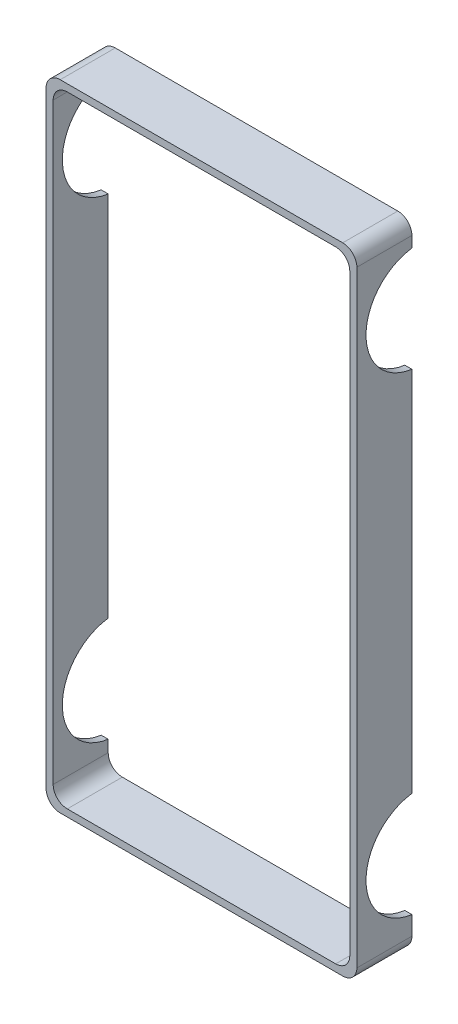
ISO-10303-21;
HEADER;
FILE_DESCRIPTION(('STEP AP214'),'2;1');
FILE_NAME('part.step','',(''),(''),'','','');
FILE_SCHEMA(('AUTOMOTIVE_DESIGN { 1 0 10303 214 1 1 1 1 }'));
ENDSEC;
DATA;
#1=APPLICATION_CONTEXT('core data for automotive mechanical design processes');
#2=APPLICATION_PROTOCOL_DEFINITION('international standard','automotive_design',2000,#1);
#3=PRODUCT_CONTEXT('',#1,'mechanical');
#4=PRODUCT('Part','Part','',(#3));
#5=PRODUCT_RELATED_PRODUCT_CATEGORY('part','',(#4));
#6=PRODUCT_DEFINITION_FORMATION('','',#4);
#7=PRODUCT_DEFINITION_CONTEXT('part definition',#1,'design');
#8=PRODUCT_DEFINITION('design','',#6,#7);
#9=PRODUCT_DEFINITION_SHAPE('','',#8);
#10=(LENGTH_UNIT() NAMED_UNIT(*) SI_UNIT(.MILLI.,.METRE.));
#11=(NAMED_UNIT(*) PLANE_ANGLE_UNIT() SI_UNIT($,.RADIAN.));
#12=(NAMED_UNIT(*) SI_UNIT($,.STERADIAN.) SOLID_ANGLE_UNIT());
#13=UNCERTAINTY_MEASURE_WITH_UNIT(LENGTH_MEASURE(1.E-05),#10,'distance_accuracy_value','');
#14=(GEOMETRIC_REPRESENTATION_CONTEXT(3) GLOBAL_UNCERTAINTY_ASSIGNED_CONTEXT((#13)) GLOBAL_UNIT_ASSIGNED_CONTEXT((#10,
#11,#12)) REPRESENTATION_CONTEXT('',''));
#15=CARTESIAN_POINT('',(0.,0.,0.));
#16=DIRECTION('',(0.,0.,1.));
#17=DIRECTION('',(1.,0.,0.));
#18=AXIS2_PLACEMENT_3D('',#15,#16,#17);
#19=CARTESIAN_POINT('',(0.,0.,0.));
#20=DIRECTION('',(0.,0.,-1.));
#21=DIRECTION('',(-1.,0.,0.));
#22=AXIS2_PLACEMENT_3D('',#19,#20,#21);
#23=PLANE('',#22);
#24=DIRECTION('',(1.,0.,0.));
#25=VECTOR('',#24,1.);
#26=CARTESIAN_POINT('',(-549.6,-254.809656263408,-1.11022302462516E-12));
#27=LINE('',#26,#25);
#28=CARTESIAN_POINT('',(170.4,-254.809656263408,0.));
#29=VERTEX_POINT('',#28);
#30=CARTESIAN_POINT('',(180.4,-254.809656263408,0.));
#31=VERTEX_POINT('',#30);
#32=EDGE_CURVE('E211',#29,#31,#27,.T.);
#33=ORIENTED_EDGE('',*,*,#32,.F.);
#34=DIRECTION('',(0.,1.,0.));
#35=VECTOR('',#34,1.);
#36=CARTESIAN_POINT('',(170.4,-440.,0.));
#37=LINE('',#36,#35);
#38=CARTESIAN_POINT('',(170.4,265.819656263407,-1.11022302462516E-12));
#39=VERTEX_POINT('',#38);
#40=EDGE_CURVE('E268',#29,#39,#37,.T.);
#41=ORIENTED_EDGE('',*,*,#40,.T.);
#42=DIRECTION('',(1.,0.,0.));
#43=VECTOR('',#42,1.);
#44=CARTESIAN_POINT('',(-549.599999999996,265.819656263407,0.));
#45=LINE('',#44,#43);
#46=CARTESIAN_POINT('',(180.4,265.819656263407,0.));
#47=VERTEX_POINT('',#46);
#48=EDGE_CURVE('E432',#39,#47,#45,.T.);
#49=ORIENTED_EDGE('',*,*,#48,.T.);
#50=DIRECTION('',(0.,1.,0.));
#51=VECTOR('',#50,1.);
#52=CARTESIAN_POINT('',(180.4,-450.,0.));
#53=LINE('',#52,#51);
#54=EDGE_CURVE('E234',#31,#47,#53,.T.);
#55=ORIENTED_EDGE('',*,*,#54,.F.);
#56=EDGE_LOOP('',(#33,#41,#49,#55));
#57=FACE_BOUND('',#56,.T.);
#58=ADVANCED_FACE('F49',(#57),#23,.T.);
#59=CARTESIAN_POINT('',(-260.,-254.809656263407,0.));
#60=VERTEX_POINT('',#59);
#61=CARTESIAN_POINT('',(-250.,-254.809656263408,0.));
#62=VERTEX_POINT('',#61);
#63=EDGE_CURVE('E72',#60,#62,#27,.T.);
#64=ORIENTED_EDGE('',*,*,#63,.F.);
#65=DIRECTION('',(0.,-1.,0.));
#66=VECTOR('',#65,1.);
#67=CARTESIAN_POINT('',(-260.,-450.,0.));
#68=LINE('',#67,#66);
#69=CARTESIAN_POINT('',(-260.,265.819656263403,0.));
#70=VERTEX_POINT('',#69);
#71=EDGE_CURVE('E429',#70,#60,#68,.T.);
#72=ORIENTED_EDGE('',*,*,#71,.F.);
#73=CARTESIAN_POINT('',(-250.,265.819656263407,0.));
#74=VERTEX_POINT('',#73);
#75=EDGE_CURVE('E417',#70,#74,#45,.T.);
#76=ORIENTED_EDGE('',*,*,#75,.T.);
#77=DIRECTION('',(0.,-1.,0.));
#78=VECTOR('',#77,1.);
#79=CARTESIAN_POINT('',(-250.,-440.,0.));
#80=LINE('',#79,#78);
#81=EDGE_CURVE('E279',#74,#62,#80,.T.);
#82=ORIENTED_EDGE('',*,*,#81,.T.);
#83=EDGE_LOOP('',(#64,#72,#76,#82));
#84=FACE_BOUND('',#83,.T.);
#85=ADVANCED_FACE('F427',(#84),#23,.T.);
#86=DIRECTION('',(1.,0.,0.));
#87=VECTOR('',#86,1.);
#88=CARTESIAN_POINT('',(-549.599999999996,414.480343736592,0.));
#89=LINE('',#88,#87);
#90=CARTESIAN_POINT('',(-260.,414.480343736588,0.));
#91=VERTEX_POINT('',#90);
#92=CARTESIAN_POINT('',(-250.,414.480343736592,0.));
#93=VERTEX_POINT('',#92);
#94=EDGE_CURVE('E420',#91,#93,#89,.T.);
#95=ORIENTED_EDGE('',*,*,#94,.F.);
#96=CARTESIAN_POINT('',(-260.,429.999999999996,0.));
#97=VERTEX_POINT('',#96);
#98=EDGE_CURVE('E547',#97,#91,#68,.T.);
#99=ORIENTED_EDGE('',*,*,#98,.F.);
#100=CARTESIAN_POINT('',(-240.,430.,0.));
#101=DIRECTION('',(0.,0.,-1.));
#102=DIRECTION('',(-1.,0.,0.));
#103=AXIS2_PLACEMENT_3D('',#100,#101,#102);
#104=CIRCLE('',#103,20.);
#105=CARTESIAN_POINT('',(-240.,450.,0.));
#106=VERTEX_POINT('',#105);
#107=EDGE_CURVE('E323',#97,#106,#104,.T.);
#108=ORIENTED_EDGE('',*,*,#107,.T.);
#109=DIRECTION('',(-1.,0.,0.));
#110=VECTOR('',#109,1.);
#111=CARTESIAN_POINT('',(-260.,449.999999999996,-1.11022302462516E-12));
#112=LINE('',#111,#110);
#113=CARTESIAN_POINT('',(160.4,450.,0.));
#114=VERTEX_POINT('',#113);
#115=EDGE_CURVE('E233',#114,#106,#112,.T.);
#116=ORIENTED_EDGE('',*,*,#115,.F.);
#117=CARTESIAN_POINT('',(160.4,430.,0.));
#118=DIRECTION('',(0.,0.,-1.));
#119=DIRECTION('',(-1.,0.,0.));
#120=AXIS2_PLACEMENT_3D('',#117,#118,#119);
#121=CIRCLE('',#120,20.);
#122=CARTESIAN_POINT('',(180.4,430.,0.));
#123=VERTEX_POINT('',#122);
#124=EDGE_CURVE('E313',#114,#123,#121,.T.);
#125=ORIENTED_EDGE('',*,*,#124,.T.);
#126=CARTESIAN_POINT('',(180.4,414.480343736592,-1.11022302462516E-12));
#127=VERTEX_POINT('',#126);
#128=EDGE_CURVE('E236',#127,#123,#53,.T.);
#129=ORIENTED_EDGE('',*,*,#128,.F.);
#130=CARTESIAN_POINT('',(170.4,414.480343736592,0.));
#131=VERTEX_POINT('',#130);
#132=EDGE_CURVE('E431',#131,#127,#89,.T.);
#133=ORIENTED_EDGE('',*,*,#132,.F.);
#134=CARTESIAN_POINT('',(170.399999999999,420.,0.));
#135=VERTEX_POINT('',#134);
#136=EDGE_CURVE('E269',#131,#135,#37,.T.);
#137=ORIENTED_EDGE('',*,*,#136,.T.);
#138=CARTESIAN_POINT('',(150.399999999999,419.999999999996,0.));
#139=DIRECTION('',(0.,0.,-1.));
#140=DIRECTION('',(-1.,0.,0.));
#141=AXIS2_PLACEMENT_3D('',#138,#139,#140);
#142=CIRCLE('',#141,20.);
#143=CARTESIAN_POINT('',(150.4,439.999999999996,0.));
#144=VERTEX_POINT('',#143);
#145=EDGE_CURVE('E394',#135,#144,#142,.F.);
#146=ORIENTED_EDGE('',*,*,#145,.T.);
#147=DIRECTION('',(-1.,0.,0.));
#148=VECTOR('',#147,1.);
#149=CARTESIAN_POINT('',(-250.,440.,0.));
#150=LINE('',#149,#148);
#151=CARTESIAN_POINT('',(-230.,440.,0.));
#152=VERTEX_POINT('',#151);
#153=EDGE_CURVE('E267',#144,#152,#150,.T.);
#154=ORIENTED_EDGE('',*,*,#153,.T.);
#155=CARTESIAN_POINT('',(-230.,420.,0.));
#156=DIRECTION('',(0.,0.,-1.));
#157=DIRECTION('',(-1.,0.,0.));
#158=AXIS2_PLACEMENT_3D('',#155,#156,#157);
#159=CIRCLE('',#158,20.);
#160=CARTESIAN_POINT('',(-250.,420.,0.));
#161=VERTEX_POINT('',#160);
#162=EDGE_CURVE('E388',#152,#161,#159,.F.);
#163=ORIENTED_EDGE('',*,*,#162,.T.);
#164=EDGE_CURVE('E274',#161,#93,#80,.T.);
#165=ORIENTED_EDGE('',*,*,#164,.T.);
#166=EDGE_LOOP('',(#95,#99,#108,#116,#125,#129,#133,#137,#146,#154,#163,#165));
#167=FACE_BOUND('',#166,.T.);
#168=ADVANCED_FACE('F465',(#167),#23,.T.);
#169=CARTESIAN_POINT('',(0.,0.,78.));
#170=DIRECTION('',(0.,0.,-1.));
#171=DIRECTION('',(-1.,0.,0.));
#172=AXIS2_PLACEMENT_3D('',#169,#170,#171);
#173=PLANE('',#172);
#174=DIRECTION('',(0.,-1.,0.));
#175=VECTOR('',#174,1.);
#176=CARTESIAN_POINT('',(-260.,-450.,78.));
#177=LINE('',#176,#175);
#178=CARTESIAN_POINT('',(-260.,429.999999999996,78.));
#179=VERTEX_POINT('',#178);
#180=CARTESIAN_POINT('',(-260.,-430.,78.));
#181=VERTEX_POINT('',#180);
#182=EDGE_CURVE('E293',#179,#181,#177,.T.);
#183=ORIENTED_EDGE('',*,*,#182,.T.);
#184=CARTESIAN_POINT('',(-240.000000000001,-430.,78.));
#185=DIRECTION('',(0.,0.,-1.));
#186=DIRECTION('',(-1.,0.,0.));
#187=AXIS2_PLACEMENT_3D('',#184,#185,#186);
#188=CIRCLE('',#187,20.);
#189=CARTESIAN_POINT('',(-240.000000000001,-450.,78.));
#190=VERTEX_POINT('',#189);
#191=EDGE_CURVE('E346',#181,#190,#188,.F.);
#192=ORIENTED_EDGE('',*,*,#191,.T.);
#193=DIRECTION('',(1.,0.,0.));
#194=VECTOR('',#193,1.);
#195=CARTESIAN_POINT('',(-260.,-450.,78.));
#196=LINE('',#195,#194);
#197=CARTESIAN_POINT('',(160.399999999999,-450.,78.));
#198=VERTEX_POINT('',#197);
#199=EDGE_CURVE('E296',#190,#198,#196,.T.);
#200=ORIENTED_EDGE('',*,*,#199,.T.);
#201=CARTESIAN_POINT('',(160.399999999999,-430.,78.));
#202=DIRECTION('',(0.,0.,-1.));
#203=DIRECTION('',(-1.,0.,0.));
#204=AXIS2_PLACEMENT_3D('',#201,#202,#203);
#205=CIRCLE('',#204,20.);
#206=CARTESIAN_POINT('',(180.399999999999,-430.,78.));
#207=VERTEX_POINT('',#206);
#208=EDGE_CURVE('E340',#198,#207,#205,.F.);
#209=ORIENTED_EDGE('',*,*,#208,.T.);
#210=DIRECTION('',(0.,1.,0.));
#211=VECTOR('',#210,1.);
#212=CARTESIAN_POINT('',(180.399999999999,-450.,78.));
#213=LINE('',#212,#211);
#214=CARTESIAN_POINT('',(180.4,430.,78.));
#215=VERTEX_POINT('',#214);
#216=EDGE_CURVE('E284',#207,#215,#213,.T.);
#217=ORIENTED_EDGE('',*,*,#216,.T.);
#218=CARTESIAN_POINT('',(160.4,429.999999999996,77.9999999999999));
#219=DIRECTION('',(0.,0.,-1.));
#220=DIRECTION('',(-1.,0.,0.));
#221=AXIS2_PLACEMENT_3D('',#218,#219,#220);
#222=CIRCLE('',#221,20.);
#223=CARTESIAN_POINT('',(160.4,449.999999999996,78.));
#224=VERTEX_POINT('',#223);
#225=EDGE_CURVE('E337',#215,#224,#222,.F.);
#226=ORIENTED_EDGE('',*,*,#225,.T.);
#227=DIRECTION('',(-1.,0.,0.));
#228=VECTOR('',#227,1.);
#229=CARTESIAN_POINT('',(-260.,449.999999999996,77.9999999999999));
#230=LINE('',#229,#228);
#231=CARTESIAN_POINT('',(-240.000000000001,450.,78.));
#232=VERTEX_POINT('',#231);
#233=EDGE_CURVE('E288',#224,#232,#230,.T.);
#234=ORIENTED_EDGE('',*,*,#233,.T.);
#235=CARTESIAN_POINT('',(-240.,430.,78.));
#236=DIRECTION('',(0.,0.,-1.));
#237=DIRECTION('',(-1.,0.,0.));
#238=AXIS2_PLACEMENT_3D('',#235,#236,#237);
#239=CIRCLE('',#238,20.);
#240=EDGE_CURVE('E343',#232,#179,#239,.F.);
#241=ORIENTED_EDGE('',*,*,#240,.T.);
#242=EDGE_LOOP('',(#183,#192,#200,#209,#217,#226,#234,#241));
#243=FACE_BOUND('',#242,.T.);
#244=DIRECTION('',(0.,1.,0.));
#245=VECTOR('',#244,1.);
#246=CARTESIAN_POINT('',(170.399999999999,-440.,78.));
#247=LINE('',#246,#245);
#248=CARTESIAN_POINT('',(170.4,-420.,78.));
#249=VERTEX_POINT('',#248);
#250=CARTESIAN_POINT('',(170.399999999999,420.,78.));
#251=VERTEX_POINT('',#250);
#252=EDGE_CURVE('E283',#249,#251,#247,.T.);
#253=ORIENTED_EDGE('',*,*,#252,.F.);
#254=CARTESIAN_POINT('',(150.4,-420.,78.));
#255=DIRECTION('',(0.,0.,-1.));
#256=DIRECTION('',(-1.,0.,0.));
#257=AXIS2_PLACEMENT_3D('',#254,#255,#256);
#258=CIRCLE('',#257,20.);
#259=CARTESIAN_POINT('',(150.399999999999,-440.,78.));
#260=VERTEX_POINT('',#259);
#261=EDGE_CURVE('E409',#249,#260,#258,.T.);
#262=ORIENTED_EDGE('',*,*,#261,.T.);
#263=DIRECTION('',(1.,0.,0.));
#264=VECTOR('',#263,1.);
#265=CARTESIAN_POINT('',(-250.000000000001,-440.,78.));
#266=LINE('',#265,#264);
#267=CARTESIAN_POINT('',(-230.000000000001,-440.,77.9999999999999));
#268=VERTEX_POINT('',#267);
#269=EDGE_CURVE('E245',#268,#260,#266,.T.);
#270=ORIENTED_EDGE('',*,*,#269,.F.);
#271=CARTESIAN_POINT('',(-230.,-420.,78.));
#272=DIRECTION('',(0.,0.,-1.));
#273=DIRECTION('',(-1.,0.,0.));
#274=AXIS2_PLACEMENT_3D('',#271,#272,#273);
#275=CIRCLE('',#274,20.);
#276=CARTESIAN_POINT('',(-250.,-420.,78.));
#277=VERTEX_POINT('',#276);
#278=EDGE_CURVE('E403',#268,#277,#275,.T.);
#279=ORIENTED_EDGE('',*,*,#278,.T.);
#280=DIRECTION('',(0.,-1.,0.));
#281=VECTOR('',#280,1.);
#282=CARTESIAN_POINT('',(-250.000000000001,-440.,78.));
#283=LINE('',#282,#281);
#284=CARTESIAN_POINT('',(-250.,419.999999999996,78.));
#285=VERTEX_POINT('',#284);
#286=EDGE_CURVE('E252',#285,#277,#283,.T.);
#287=ORIENTED_EDGE('',*,*,#286,.F.);
#288=CARTESIAN_POINT('',(-230.,420.,78.));
#289=DIRECTION('',(0.,0.,-1.));
#290=DIRECTION('',(-1.,0.,0.));
#291=AXIS2_PLACEMENT_3D('',#288,#289,#290);
#292=CIRCLE('',#291,20.);
#293=CARTESIAN_POINT('',(-230.000000000001,440.,78.));
#294=VERTEX_POINT('',#293);
#295=EDGE_CURVE('E391',#285,#294,#292,.T.);
#296=ORIENTED_EDGE('',*,*,#295,.T.);
#297=DIRECTION('',(-1.,0.,0.));
#298=VECTOR('',#297,1.);
#299=CARTESIAN_POINT('',(-250.,439.999999999996,78.));
#300=LINE('',#299,#298);
#301=CARTESIAN_POINT('',(150.4,439.999999999996,78.));
#302=VERTEX_POINT('',#301);
#303=EDGE_CURVE('E261',#302,#294,#300,.T.);
#304=ORIENTED_EDGE('',*,*,#303,.F.);
#305=CARTESIAN_POINT('',(150.399999999999,419.999999999996,78.));
#306=DIRECTION('',(0.,0.,-1.));
#307=DIRECTION('',(-1.,0.,0.));
#308=AXIS2_PLACEMENT_3D('',#305,#306,#307);
#309=CIRCLE('',#308,20.);
#310=EDGE_CURVE('E397',#302,#251,#309,.T.);
#311=ORIENTED_EDGE('',*,*,#310,.T.);
#312=EDGE_LOOP('',(#253,#262,#270,#279,#287,#296,#304,#311));
#313=FACE_BOUND('',#312,.T.);
#314=ADVANCED_FACE('F454',(#243,#313),#173,.F.);
#315=DIRECTION('',(1.,0.,0.));
#316=VECTOR('',#315,1.);
#317=CARTESIAN_POINT('',(-549.6,-403.470343736593,0.));
#318=LINE('',#317,#316);
#319=CARTESIAN_POINT('',(170.4,-403.470343736593,0.));
#320=VERTEX_POINT('',#319);
#321=CARTESIAN_POINT('',(180.4,-403.470343736593,0.));
#322=VERTEX_POINT('',#321);
#323=EDGE_CURVE('E65',#320,#322,#318,.T.);
#324=ORIENTED_EDGE('',*,*,#323,.T.);
#325=CARTESIAN_POINT('',(180.399999999999,-430.,0.));
#326=VERTEX_POINT('',#325);
#327=EDGE_CURVE('E221',#326,#322,#53,.T.);
#328=ORIENTED_EDGE('',*,*,#327,.F.);
#329=CARTESIAN_POINT('',(160.399999999999,-430.,0.));
#330=DIRECTION('',(0.,0.,-1.));
#331=DIRECTION('',(-1.,0.,0.));
#332=AXIS2_PLACEMENT_3D('',#329,#330,#331);
#333=CIRCLE('',#332,20.);
#334=CARTESIAN_POINT('',(160.399999999999,-450.,0.));
#335=VERTEX_POINT('',#334);
#336=EDGE_CURVE('E320',#326,#335,#333,.T.);
#337=ORIENTED_EDGE('',*,*,#336,.T.);
#338=DIRECTION('',(1.,0.,0.));
#339=VECTOR('',#338,1.);
#340=CARTESIAN_POINT('',(-260.,-450.,0.));
#341=LINE('',#340,#339);
#342=CARTESIAN_POINT('',(-240.,-450.,0.));
#343=VERTEX_POINT('',#342);
#344=EDGE_CURVE('E289',#343,#335,#341,.T.);
#345=ORIENTED_EDGE('',*,*,#344,.F.);
#346=CARTESIAN_POINT('',(-240.,-430.,0.));
#347=DIRECTION('',(0.,0.,-1.));
#348=DIRECTION('',(-1.,0.,0.));
#349=AXIS2_PLACEMENT_3D('',#346,#347,#348);
#350=CIRCLE('',#349,20.);
#351=CARTESIAN_POINT('',(-260.,-430.,0.));
#352=VERTEX_POINT('',#351);
#353=EDGE_CURVE('E326',#343,#352,#350,.T.);
#354=ORIENTED_EDGE('',*,*,#353,.T.);
#355=CARTESIAN_POINT('',(-260.,-403.470343736592,0.));
#356=VERTEX_POINT('',#355);
#357=EDGE_CURVE('E241',#356,#352,#68,.T.);
#358=ORIENTED_EDGE('',*,*,#357,.F.);
#359=CARTESIAN_POINT('',(-250.,-403.470343736593,-1.11022302462516E-12));
#360=VERTEX_POINT('',#359);
#361=EDGE_CURVE('E225',#356,#360,#318,.T.);
#362=ORIENTED_EDGE('',*,*,#361,.T.);
#363=CARTESIAN_POINT('',(-250.,-420.,0.));
#364=VERTEX_POINT('',#363);
#365=EDGE_CURVE('E273',#360,#364,#80,.T.);
#366=ORIENTED_EDGE('',*,*,#365,.T.);
#367=CARTESIAN_POINT('',(-230.,-420.,0.));
#368=DIRECTION('',(0.,0.,-1.));
#369=DIRECTION('',(-1.,0.,0.));
#370=AXIS2_PLACEMENT_3D('',#367,#368,#369);
#371=CIRCLE('',#370,20.);
#372=CARTESIAN_POINT('',(-230.,-440.,0.));
#373=VERTEX_POINT('',#372);
#374=EDGE_CURVE('E400',#364,#373,#371,.F.);
#375=ORIENTED_EDGE('',*,*,#374,.T.);
#376=DIRECTION('',(1.,0.,0.));
#377=VECTOR('',#376,1.);
#378=CARTESIAN_POINT('',(-250.,-440.,0.));
#379=LINE('',#378,#377);
#380=CARTESIAN_POINT('',(150.399999999999,-440.,0.));
#381=VERTEX_POINT('',#380);
#382=EDGE_CURVE('E278',#373,#381,#379,.T.);
#383=ORIENTED_EDGE('',*,*,#382,.T.);
#384=CARTESIAN_POINT('',(150.4,-420.,0.));
#385=DIRECTION('',(0.,0.,-1.));
#386=DIRECTION('',(-1.,0.,0.));
#387=AXIS2_PLACEMENT_3D('',#384,#385,#386);
#388=CIRCLE('',#387,20.);
#389=CARTESIAN_POINT('',(170.4,-420.,0.));
#390=VERTEX_POINT('',#389);
#391=EDGE_CURVE('E406',#381,#390,#388,.F.);
#392=ORIENTED_EDGE('',*,*,#391,.T.);
#393=EDGE_CURVE('E223',#390,#320,#37,.T.);
#394=ORIENTED_EDGE('',*,*,#393,.T.);
#395=EDGE_LOOP('',(#324,#328,#337,#345,#354,#358,#362,#366,#375,#383,#392,#394));
#396=FACE_BOUND('',#395,.T.);
#397=ADVANCED_FACE('F220',(#396),#23,.T.);
#398=CARTESIAN_POINT('',(180.399999999999,-450.,78.));
#399=DIRECTION('',(-1.,0.,0.));
#400=DIRECTION('',(0.,0.,1.));
#401=AXIS2_PLACEMENT_3D('',#398,#399,#400);
#402=PLANE('',#401);
#403=ORIENTED_EDGE('',*,*,#327,.T.);
#404=CARTESIAN_POINT('',(180.4,-329.14,-10.));
#405=DIRECTION('',(1.,0.,0.));
#406=DIRECTION('',(0.,0.,-1.));
#407=AXIS2_PLACEMENT_3D('',#404,#405,#406);
#408=CIRCLE('',#407,75.);
#409=EDGE_CURVE('E208',#31,#322,#408,.T.);
#410=ORIENTED_EDGE('',*,*,#409,.F.);
#411=ORIENTED_EDGE('',*,*,#54,.T.);
#412=CARTESIAN_POINT('',(180.4,340.15,-10.));
#413=DIRECTION('',(1.,0.,0.));
#414=DIRECTION('',(0.,0.,-1.));
#415=AXIS2_PLACEMENT_3D('',#412,#413,#414);
#416=CIRCLE('',#415,75.);
#417=EDGE_CURVE('E492',#127,#47,#416,.T.);
#418=ORIENTED_EDGE('',*,*,#417,.F.);
#419=ORIENTED_EDGE('',*,*,#128,.T.);
#420=DIRECTION('',(0.,0.,-1.));
#421=VECTOR('',#420,1.);
#422=CARTESIAN_POINT('',(180.4,430.,78.));
#423=LINE('',#422,#421);
#424=EDGE_CURVE('E356',#123,#215,#423,.F.);
#425=ORIENTED_EDGE('',*,*,#424,.T.);
#426=ORIENTED_EDGE('',*,*,#216,.F.);
#427=DIRECTION('',(0.,0.,-1.));
#428=VECTOR('',#427,1.);
#429=CARTESIAN_POINT('',(180.399999999999,-430.,78.));
#430=LINE('',#429,#428);
#431=EDGE_CURVE('E231',#207,#326,#430,.T.);
#432=ORIENTED_EDGE('',*,*,#431,.T.);
#433=EDGE_LOOP('',(#403,#410,#411,#418,#419,#425,#426,#432));
#434=FACE_BOUND('',#433,.T.);
#435=ADVANCED_FACE('F228',(#434),#402,.F.);
#436=CARTESIAN_POINT('',(-260.,449.999999999996,77.9999999999999));
#437=DIRECTION('',(0.,-1.,0.));
#438=DIRECTION('',(0.,0.,-1.));
#439=AXIS2_PLACEMENT_3D('',#436,#437,#438);
#440=PLANE('',#439);
#441=ORIENTED_EDGE('',*,*,#115,.T.);
#442=DIRECTION('',(0.,0.,-1.));
#443=VECTOR('',#442,1.);
#444=CARTESIAN_POINT('',(-240.000000000001,450.,78.));
#445=LINE('',#444,#443);
#446=EDGE_CURVE('E353',#106,#232,#445,.F.);
#447=ORIENTED_EDGE('',*,*,#446,.T.);
#448=ORIENTED_EDGE('',*,*,#233,.F.);
#449=DIRECTION('',(0.,0.,-1.));
#450=VECTOR('',#449,1.);
#451=CARTESIAN_POINT('',(160.4,449.999999999996,78.));
#452=LINE('',#451,#450);
#453=EDGE_CURVE('E349',#224,#114,#452,.T.);
#454=ORIENTED_EDGE('',*,*,#453,.T.);
#455=EDGE_LOOP('',(#441,#447,#448,#454));
#456=FACE_BOUND('',#455,.T.);
#457=ADVANCED_FACE('F569',(#456),#440,.F.);
#458=CARTESIAN_POINT('',(-260.,-450.,78.));
#459=DIRECTION('',(1.,0.,0.));
#460=DIRECTION('',(0.,0.,-1.));
#461=AXIS2_PLACEMENT_3D('',#458,#459,#460);
#462=PLANE('',#461);
#463=ORIENTED_EDGE('',*,*,#71,.T.);
#464=CARTESIAN_POINT('',(-260.,-329.14,-10.));
#465=DIRECTION('',(1.,0.,0.));
#466=DIRECTION('',(0.,0.,-1.));
#467=AXIS2_PLACEMENT_3D('',#464,#465,#466);
#468=CIRCLE('',#467,75.);
#469=EDGE_CURVE('E498',#60,#356,#468,.T.);
#470=ORIENTED_EDGE('',*,*,#469,.T.);
#471=ORIENTED_EDGE('',*,*,#357,.T.);
#472=DIRECTION('',(0.,0.,-1.));
#473=VECTOR('',#472,1.);
#474=CARTESIAN_POINT('',(-260.,-430.,78.));
#475=LINE('',#474,#473);
#476=EDGE_CURVE('E334',#352,#181,#475,.F.);
#477=ORIENTED_EDGE('',*,*,#476,.T.);
#478=ORIENTED_EDGE('',*,*,#182,.F.);
#479=DIRECTION('',(0.,0.,-1.));
#480=VECTOR('',#479,1.);
#481=CARTESIAN_POINT('',(-260.,429.999999999996,78.));
#482=LINE('',#481,#480);
#483=EDGE_CURVE('E330',#179,#97,#482,.T.);
#484=ORIENTED_EDGE('',*,*,#483,.T.);
#485=ORIENTED_EDGE('',*,*,#98,.T.);
#486=CARTESIAN_POINT('',(-260.,340.15,-10.));
#487=DIRECTION('',(1.,0.,0.));
#488=DIRECTION('',(0.,0.,-1.));
#489=AXIS2_PLACEMENT_3D('',#486,#487,#488);
#490=CIRCLE('',#489,75.);
#491=EDGE_CURVE('E484',#91,#70,#490,.T.);
#492=ORIENTED_EDGE('',*,*,#491,.T.);
#493=EDGE_LOOP('',(#463,#470,#471,#477,#478,#484,#485,#492));
#494=FACE_BOUND('',#493,.T.);
#495=ADVANCED_FACE('F557',(#494),#462,.F.);
#496=CARTESIAN_POINT('',(-260.,-450.,78.));
#497=DIRECTION('',(0.,1.,0.));
#498=DIRECTION('',(-1.,0.,0.));
#499=AXIS2_PLACEMENT_3D('',#496,#497,#498);
#500=PLANE('',#499);
#501=ORIENTED_EDGE('',*,*,#199,.F.);
#502=DIRECTION('',(0.,0.,-1.));
#503=VECTOR('',#502,1.);
#504=CARTESIAN_POINT('',(-240.000000000001,-450.,78.));
#505=LINE('',#504,#503);
#506=EDGE_CURVE('E305',#190,#343,#505,.T.);
#507=ORIENTED_EDGE('',*,*,#506,.T.);
#508=ORIENTED_EDGE('',*,*,#344,.T.);
#509=DIRECTION('',(0.,0.,-1.));
#510=VECTOR('',#509,1.);
#511=CARTESIAN_POINT('',(160.399999999999,-450.,78.));
#512=LINE('',#511,#510);
#513=EDGE_CURVE('E299',#335,#198,#512,.F.);
#514=ORIENTED_EDGE('',*,*,#513,.T.);
#515=EDGE_LOOP('',(#501,#507,#508,#514));
#516=FACE_BOUND('',#515,.T.);
#517=ADVANCED_FACE('F544',(#516),#500,.F.);
#518=CARTESIAN_POINT('',(170.399999999999,-440.,78.));
#519=DIRECTION('',(-1.,0.,0.));
#520=DIRECTION('',(0.,0.,1.));
#521=AXIS2_PLACEMENT_3D('',#518,#519,#520);
#522=PLANE('',#521);
#523=CARTESIAN_POINT('',(170.4,-329.14,-10.0000000000011));
#524=DIRECTION('',(-1.,0.,0.));
#525=DIRECTION('',(0.,0.,1.));
#526=AXIS2_PLACEMENT_3D('',#523,#524,#525);
#527=CIRCLE('',#526,75.);
#528=EDGE_CURVE('E502',#320,#29,#527,.T.);
#529=ORIENTED_EDGE('',*,*,#528,.F.);
#530=ORIENTED_EDGE('',*,*,#393,.F.);
#531=DIRECTION('',(0.,0.,-1.));
#532=VECTOR('',#531,1.);
#533=CARTESIAN_POINT('',(170.4,-420.,78.));
#534=LINE('',#533,#532);
#535=EDGE_CURVE('E375',#390,#249,#534,.F.);
#536=ORIENTED_EDGE('',*,*,#535,.T.);
#537=ORIENTED_EDGE('',*,*,#252,.T.);
#538=DIRECTION('',(0.,0.,-1.));
#539=VECTOR('',#538,1.);
#540=CARTESIAN_POINT('',(170.399999999999,420.,0.));
#541=LINE('',#540,#539);
#542=EDGE_CURVE('E378',#251,#135,#541,.T.);
#543=ORIENTED_EDGE('',*,*,#542,.T.);
#544=ORIENTED_EDGE('',*,*,#136,.F.);
#545=CARTESIAN_POINT('',(170.4,340.15,-10.));
#546=DIRECTION('',(-1.,0.,0.));
#547=DIRECTION('',(0.,0.,1.));
#548=AXIS2_PLACEMENT_3D('',#545,#546,#547);
#549=CIRCLE('',#548,75.);
#550=EDGE_CURVE('E487',#39,#131,#549,.T.);
#551=ORIENTED_EDGE('',*,*,#550,.F.);
#552=ORIENTED_EDGE('',*,*,#40,.F.);
#553=EDGE_LOOP('',(#529,#530,#536,#537,#543,#544,#551,#552));
#554=FACE_BOUND('',#553,.T.);
#555=ADVANCED_FACE('F475',(#554),#522,.T.);
#556=CARTESIAN_POINT('',(-250.,439.999999999996,78.));
#557=DIRECTION('',(0.,-1.,0.));
#558=DIRECTION('',(0.,0.,-1.));
#559=AXIS2_PLACEMENT_3D('',#556,#557,#558);
#560=PLANE('',#559);
#561=ORIENTED_EDGE('',*,*,#303,.T.);
#562=DIRECTION('',(0.,0.,-1.));
#563=VECTOR('',#562,1.);
#564=CARTESIAN_POINT('',(-230.,440.,0.));
#565=LINE('',#564,#563);
#566=EDGE_CURVE('E364',#294,#152,#565,.T.);
#567=ORIENTED_EDGE('',*,*,#566,.T.);
#568=ORIENTED_EDGE('',*,*,#153,.F.);
#569=DIRECTION('',(0.,0.,-1.));
#570=VECTOR('',#569,1.);
#571=CARTESIAN_POINT('',(150.4,439.999999999996,78.));
#572=LINE('',#571,#570);
#573=EDGE_CURVE('E361',#144,#302,#572,.F.);
#574=ORIENTED_EDGE('',*,*,#573,.T.);
#575=EDGE_LOOP('',(#561,#567,#568,#574));
#576=FACE_BOUND('',#575,.T.);
#577=ADVANCED_FACE('F462',(#576),#560,.T.);
#578=CARTESIAN_POINT('',(-250.000000000001,-440.,78.));
#579=DIRECTION('',(1.,0.,0.));
#580=DIRECTION('',(0.,0.,-1.));
#581=AXIS2_PLACEMENT_3D('',#578,#579,#580);
#582=PLANE('',#581);
#583=CARTESIAN_POINT('',(-250.,-329.14,-10.));
#584=DIRECTION('',(1.,0.,0.));
#585=DIRECTION('',(0.,0.,-1.));
#586=AXIS2_PLACEMENT_3D('',#583,#584,#585);
#587=CIRCLE('',#586,75.);
#588=EDGE_CURVE('E11',#62,#360,#587,.T.);
#589=ORIENTED_EDGE('',*,*,#588,.F.);
#590=ORIENTED_EDGE('',*,*,#81,.F.);
#591=CARTESIAN_POINT('',(-250.,340.15,-10.));
#592=DIRECTION('',(1.,0.,0.));
#593=DIRECTION('',(0.,0.,-1.));
#594=AXIS2_PLACEMENT_3D('',#591,#592,#593);
#595=CIRCLE('',#594,75.);
#596=EDGE_CURVE('E58',#93,#74,#595,.T.);
#597=ORIENTED_EDGE('',*,*,#596,.F.);
#598=ORIENTED_EDGE('',*,*,#164,.F.);
#599=DIRECTION('',(0.,0.,-1.));
#600=VECTOR('',#599,1.);
#601=CARTESIAN_POINT('',(-250.,419.999999999996,78.));
#602=LINE('',#601,#600);
#603=EDGE_CURVE('E372',#161,#285,#602,.F.);
#604=ORIENTED_EDGE('',*,*,#603,.T.);
#605=ORIENTED_EDGE('',*,*,#286,.T.);
#606=DIRECTION('',(0.,0.,-1.));
#607=VECTOR('',#606,1.);
#608=CARTESIAN_POINT('',(-250.,-420.,0.));
#609=LINE('',#608,#607);
#610=EDGE_CURVE('E368',#277,#364,#609,.T.);
#611=ORIENTED_EDGE('',*,*,#610,.T.);
#612=ORIENTED_EDGE('',*,*,#365,.F.);
#613=EDGE_LOOP('',(#589,#590,#597,#598,#604,#605,#611,#612));
#614=FACE_BOUND('',#613,.T.);
#615=ADVANCED_FACE('F434',(#614),#582,.T.);
#616=CARTESIAN_POINT('',(-250.000000000001,-440.,78.));
#617=DIRECTION('',(0.,1.,0.));
#618=DIRECTION('',(0.,0.,1.));
#619=AXIS2_PLACEMENT_3D('',#616,#617,#618);
#620=PLANE('',#619);
#621=ORIENTED_EDGE('',*,*,#382,.F.);
#622=DIRECTION('',(0.,0.,-1.));
#623=VECTOR('',#622,1.);
#624=CARTESIAN_POINT('',(-230.000000000001,-440.,77.9999999999999));
#625=LINE('',#624,#623);
#626=EDGE_CURVE('E385',#373,#268,#625,.F.);
#627=ORIENTED_EDGE('',*,*,#626,.T.);
#628=ORIENTED_EDGE('',*,*,#269,.T.);
#629=DIRECTION('',(0.,0.,-1.));
#630=VECTOR('',#629,1.);
#631=CARTESIAN_POINT('',(150.399999999999,-440.,0.));
#632=LINE('',#631,#630);
#633=EDGE_CURVE('E382',#260,#381,#632,.T.);
#634=ORIENTED_EDGE('',*,*,#633,.T.);
#635=EDGE_LOOP('',(#621,#627,#628,#634));
#636=FACE_BOUND('',#635,.T.);
#637=ADVANCED_FACE('F630',(#636),#620,.T.);
#638=CARTESIAN_POINT('',(-240.000000000001,-430.,78.));
#639=DIRECTION('',(0.,0.,-1.));
#640=DIRECTION('',(-1.,0.,0.));
#641=AXIS2_PLACEMENT_3D('',#638,#639,#640);
#642=CYLINDRICAL_SURFACE('',#641,20.);
#643=ORIENTED_EDGE('',*,*,#191,.F.);
#644=ORIENTED_EDGE('',*,*,#476,.F.);
#645=ORIENTED_EDGE('',*,*,#353,.F.);
#646=ORIENTED_EDGE('',*,*,#506,.F.);
#647=EDGE_LOOP('',(#643,#644,#645,#646));
#648=FACE_BOUND('',#647,.T.);
#649=ADVANCED_FACE('F562',(#648),#642,.T.);
#650=CARTESIAN_POINT('',(-240.,430.,78.));
#651=DIRECTION('',(0.,0.,-1.));
#652=DIRECTION('',(-1.,0.,0.));
#653=AXIS2_PLACEMENT_3D('',#650,#651,#652);
#654=CYLINDRICAL_SURFACE('',#653,20.);
#655=ORIENTED_EDGE('',*,*,#240,.F.);
#656=ORIENTED_EDGE('',*,*,#446,.F.);
#657=ORIENTED_EDGE('',*,*,#107,.F.);
#658=ORIENTED_EDGE('',*,*,#483,.F.);
#659=EDGE_LOOP('',(#655,#656,#657,#658));
#660=FACE_BOUND('',#659,.T.);
#661=ADVANCED_FACE('F566',(#660),#654,.T.);
#662=CARTESIAN_POINT('',(160.399999999999,-430.,78.));
#663=DIRECTION('',(0.,0.,-1.));
#664=DIRECTION('',(-1.,0.,0.));
#665=AXIS2_PLACEMENT_3D('',#662,#663,#664);
#666=CYLINDRICAL_SURFACE('',#665,20.);
#667=ORIENTED_EDGE('',*,*,#208,.F.);
#668=ORIENTED_EDGE('',*,*,#513,.F.);
#669=ORIENTED_EDGE('',*,*,#336,.F.);
#670=ORIENTED_EDGE('',*,*,#431,.F.);
#671=EDGE_LOOP('',(#667,#668,#669,#670));
#672=FACE_BOUND('',#671,.T.);
#673=ADVANCED_FACE('F542',(#672),#666,.T.);
#674=CARTESIAN_POINT('',(160.4,429.999999999996,77.9999999999999));
#675=DIRECTION('',(0.,0.,-1.));
#676=DIRECTION('',(-1.,0.,0.));
#677=AXIS2_PLACEMENT_3D('',#674,#675,#676);
#678=CYLINDRICAL_SURFACE('',#677,20.);
#679=ORIENTED_EDGE('',*,*,#225,.F.);
#680=ORIENTED_EDGE('',*,*,#424,.F.);
#681=ORIENTED_EDGE('',*,*,#124,.F.);
#682=ORIENTED_EDGE('',*,*,#453,.F.);
#683=EDGE_LOOP('',(#679,#680,#681,#682));
#684=FACE_BOUND('',#683,.T.);
#685=ADVANCED_FACE('F539',(#684),#678,.T.);
#686=CARTESIAN_POINT('',(-230.,420.,78.));
#687=DIRECTION('',(0.,0.,1.));
#688=DIRECTION('',(1.,0.,0.));
#689=AXIS2_PLACEMENT_3D('',#686,#687,#688);
#690=CYLINDRICAL_SURFACE('',#689,20.);
#691=ORIENTED_EDGE('',*,*,#295,.F.);
#692=ORIENTED_EDGE('',*,*,#603,.F.);
#693=ORIENTED_EDGE('',*,*,#162,.F.);
#694=ORIENTED_EDGE('',*,*,#566,.F.);
#695=EDGE_LOOP('',(#691,#692,#693,#694));
#696=FACE_BOUND('',#695,.T.);
#697=ADVANCED_FACE('F459',(#696),#690,.F.);
#698=CARTESIAN_POINT('',(150.399999999999,419.999999999996,78.));
#699=DIRECTION('',(0.,0.,1.));
#700=DIRECTION('',(1.,0.,0.));
#701=AXIS2_PLACEMENT_3D('',#698,#699,#700);
#702=CYLINDRICAL_SURFACE('',#701,20.);
#703=ORIENTED_EDGE('',*,*,#310,.F.);
#704=ORIENTED_EDGE('',*,*,#573,.F.);
#705=ORIENTED_EDGE('',*,*,#145,.F.);
#706=ORIENTED_EDGE('',*,*,#542,.F.);
#707=EDGE_LOOP('',(#703,#704,#705,#706));
#708=FACE_BOUND('',#707,.T.);
#709=ADVANCED_FACE('F472',(#708),#702,.F.);
#710=CARTESIAN_POINT('',(-230.,-420.,78.));
#711=DIRECTION('',(0.,0.,1.));
#712=DIRECTION('',(1.,0.,0.));
#713=AXIS2_PLACEMENT_3D('',#710,#711,#712);
#714=CYLINDRICAL_SURFACE('',#713,20.);
#715=ORIENTED_EDGE('',*,*,#278,.F.);
#716=ORIENTED_EDGE('',*,*,#626,.F.);
#717=ORIENTED_EDGE('',*,*,#374,.F.);
#718=ORIENTED_EDGE('',*,*,#610,.F.);
#719=EDGE_LOOP('',(#715,#716,#717,#718));
#720=FACE_BOUND('',#719,.T.);
#721=ADVANCED_FACE('F448',(#720),#714,.F.);
#722=CARTESIAN_POINT('',(150.4,-420.,78.));
#723=DIRECTION('',(0.,0.,1.));
#724=DIRECTION('',(1.,0.,0.));
#725=AXIS2_PLACEMENT_3D('',#722,#723,#724);
#726=CYLINDRICAL_SURFACE('',#725,20.);
#727=ORIENTED_EDGE('',*,*,#261,.F.);
#728=ORIENTED_EDGE('',*,*,#535,.F.);
#729=ORIENTED_EDGE('',*,*,#391,.F.);
#730=ORIENTED_EDGE('',*,*,#633,.F.);
#731=EDGE_LOOP('',(#727,#728,#729,#730));
#732=FACE_BOUND('',#731,.T.);
#733=ADVANCED_FACE('F51',(#732),#726,.F.);
#734=CARTESIAN_POINT('',(-549.6,340.15,-10.0000000000011));
#735=DIRECTION('',(1.,0.,0.));
#736=DIRECTION('',(0.,0.,-1.));
#737=AXIS2_PLACEMENT_3D('',#734,#735,#736);
#738=CYLINDRICAL_SURFACE('',#737,75.);
#739=ORIENTED_EDGE('',*,*,#94,.T.);
#740=ORIENTED_EDGE('',*,*,#596,.T.);
#741=ORIENTED_EDGE('',*,*,#75,.F.);
#742=ORIENTED_EDGE('',*,*,#491,.F.);
#743=EDGE_LOOP('',(#739,#740,#741,#742));
#744=FACE_BOUND('',#743,.T.);
#745=ADVANCED_FACE('F416',(#744),#738,.F.);
#746=ORIENTED_EDGE('',*,*,#550,.T.);
#747=ORIENTED_EDGE('',*,*,#132,.T.);
#748=ORIENTED_EDGE('',*,*,#417,.T.);
#749=ORIENTED_EDGE('',*,*,#48,.F.);
#750=EDGE_LOOP('',(#746,#747,#748,#749));
#751=FACE_BOUND('',#750,.T.);
#752=ADVANCED_FACE('F533',(#751),#738,.F.);
#753=CARTESIAN_POINT('',(-549.6,-329.14,-10.));
#754=DIRECTION('',(1.,0.,0.));
#755=DIRECTION('',(0.,0.,-1.));
#756=AXIS2_PLACEMENT_3D('',#753,#754,#755);
#757=CYLINDRICAL_SURFACE('',#756,75.);
#758=ORIENTED_EDGE('',*,*,#63,.T.);
#759=ORIENTED_EDGE('',*,*,#588,.T.);
#760=ORIENTED_EDGE('',*,*,#361,.F.);
#761=ORIENTED_EDGE('',*,*,#469,.F.);
#762=EDGE_LOOP('',(#758,#759,#760,#761));
#763=FACE_BOUND('',#762,.T.);
#764=ADVANCED_FACE('F610',(#763),#757,.F.);
#765=ORIENTED_EDGE('',*,*,#528,.T.);
#766=ORIENTED_EDGE('',*,*,#32,.T.);
#767=ORIENTED_EDGE('',*,*,#409,.T.);
#768=ORIENTED_EDGE('',*,*,#323,.F.);
#769=EDGE_LOOP('',(#765,#766,#767,#768));
#770=FACE_BOUND('',#769,.T.);
#771=ADVANCED_FACE('F209',(#770),#757,.F.);
#772=CLOSED_SHELL('',(#58,#85,#168,#314,#397,#435,#457,#495,#517,#555,#577,#615,#637,#649,#661,
#673,#685,#697,#709,#721,#733,#745,#752,#764,#771));
#773=MANIFOLD_SOLID_BREP('B2',#772);
#774=ADVANCED_BREP_SHAPE_REPRESENTATION('',(#18,#773),#14);
#775=SHAPE_DEFINITION_REPRESENTATION(#9,#774);
ENDSEC;
END-ISO-10303-21;
